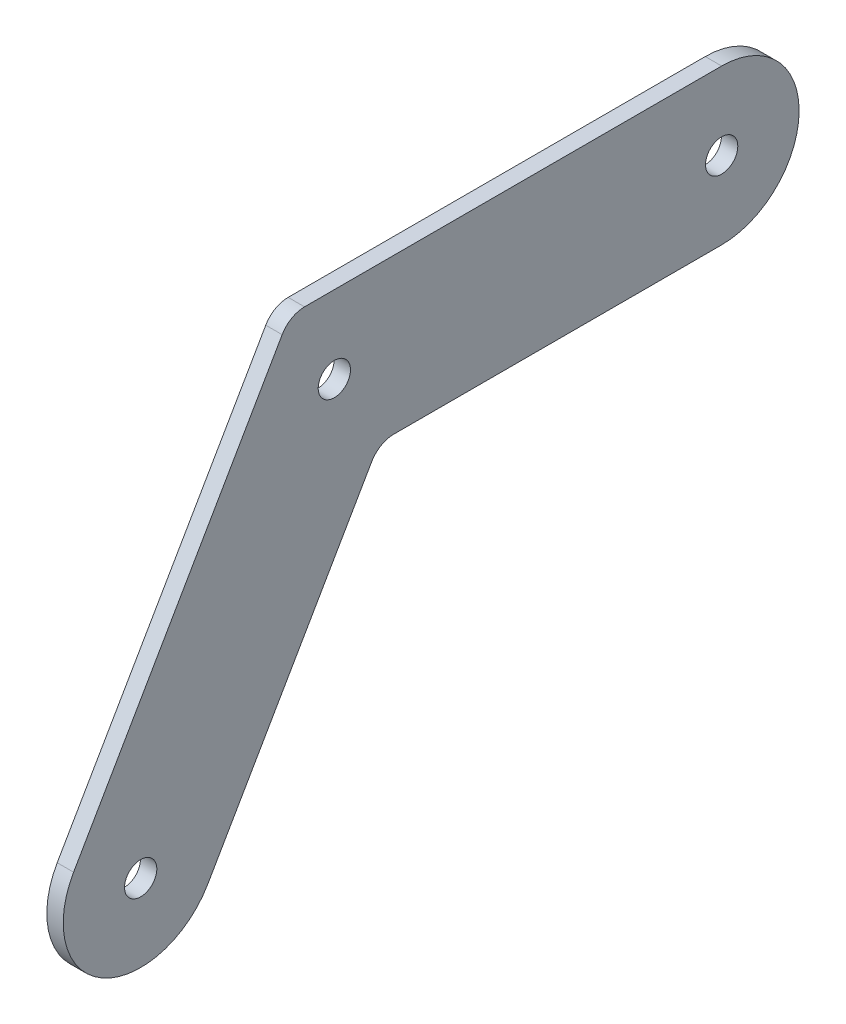
ISO-10303-21;
HEADER;
FILE_DESCRIPTION(('STEP AP214'),'2;1');
FILE_NAME('part.step','',(''),(''),'','','');
FILE_SCHEMA(('AUTOMOTIVE_DESIGN { 1 0 10303 214 1 1 1 1 }'));
ENDSEC;
DATA;
#1=APPLICATION_CONTEXT('core data for automotive mechanical design processes');
#2=APPLICATION_PROTOCOL_DEFINITION('international standard','automotive_design',2000,#1);
#3=PRODUCT_CONTEXT('',#1,'mechanical');
#4=PRODUCT('Part','Part','',(#3));
#5=PRODUCT_RELATED_PRODUCT_CATEGORY('part','',(#4));
#6=PRODUCT_DEFINITION_FORMATION('','',#4);
#7=PRODUCT_DEFINITION_CONTEXT('part definition',#1,'design');
#8=PRODUCT_DEFINITION('design','',#6,#7);
#9=PRODUCT_DEFINITION_SHAPE('','',#8);
#10=(LENGTH_UNIT() NAMED_UNIT(*) SI_UNIT(.MILLI.,.METRE.));
#11=(NAMED_UNIT(*) PLANE_ANGLE_UNIT() SI_UNIT($,.RADIAN.));
#12=(NAMED_UNIT(*) SI_UNIT($,.STERADIAN.) SOLID_ANGLE_UNIT());
#13=UNCERTAINTY_MEASURE_WITH_UNIT(LENGTH_MEASURE(1.E-05),#10,'distance_accuracy_value','');
#14=(GEOMETRIC_REPRESENTATION_CONTEXT(3) GLOBAL_UNCERTAINTY_ASSIGNED_CONTEXT((#13)) GLOBAL_UNIT_ASSIGNED_CONTEXT((#10,
#11,#12)) REPRESENTATION_CONTEXT('',''));
#15=CARTESIAN_POINT('',(0.,0.,0.));
#16=DIRECTION('',(0.,0.,1.));
#17=DIRECTION('',(1.,0.,0.));
#18=AXIS2_PLACEMENT_3D('',#15,#16,#17);
#19=CARTESIAN_POINT('',(3.175,30.,17.3205080756887));
#20=DIRECTION('',(0.,-0.500000000000004,-0.866025403784436));
#21=DIRECTION('',(0.,0.866025403784436,-0.500000000000004));
#22=AXIS2_PLACEMENT_3D('',#19,#20,#21);
#23=PLANE('',#22);
#24=DIRECTION('',(0.,-0.866025403784436,0.500000000000004));
#25=VECTOR('',#24,1.);
#26=CARTESIAN_POINT('',(3.175,30.,17.3205080756887));
#27=LINE('',#26,#25);
#28=CARTESIAN_POINT('',(3.175,25.,20.2072594216368));
#29=VERTEX_POINT('',#28);
#30=CARTESIAN_POINT('',(3.175,-114.903810567665,100.980762113534));
#31=VERTEX_POINT('',#30);
#32=EDGE_CURVE('E98',#29,#31,#27,.T.);
#33=ORIENTED_EDGE('',*,*,#32,.F.);
#34=DIRECTION('',(-1.,0.,0.));
#35=VECTOR('',#34,1.);
#36=CARTESIAN_POINT('',(3.175,25.,20.2072594216368));
#37=LINE('',#36,#35);
#38=CARTESIAN_POINT('',(-3.175,25.,20.2072594216368));
#39=VERTEX_POINT('',#38);
#40=EDGE_CURVE('E133',#29,#39,#37,.T.);
#41=ORIENTED_EDGE('',*,*,#40,.T.);
#42=DIRECTION('',(0.,-0.866025403784436,0.500000000000004));
#43=VECTOR('',#42,1.);
#44=CARTESIAN_POINT('',(-3.175,30.,17.3205080756887));
#45=LINE('',#44,#43);
#46=CARTESIAN_POINT('',(-3.175,-114.903810567665,100.980762113534));
#47=VERTEX_POINT('',#46);
#48=EDGE_CURVE('E121',#39,#47,#45,.T.);
#49=ORIENTED_EDGE('',*,*,#48,.T.);
#50=DIRECTION('',(-1.,0.,0.));
#51=VECTOR('',#50,1.);
#52=CARTESIAN_POINT('',(3.175,-114.903810567665,100.980762113534));
#53=LINE('',#52,#51);
#54=EDGE_CURVE('E115',#31,#47,#53,.T.);
#55=ORIENTED_EDGE('',*,*,#54,.F.);
#56=EDGE_LOOP('',(#33,#41,#49,#55));
#57=FACE_BOUND('',#56,.T.);
#58=ADVANCED_FACE('F33',(#57),#23,.F.);
#59=CARTESIAN_POINT('',(3.175,-129.903810567665,75.0000000000006));
#60=DIRECTION('',(-1.,0.,0.));
#61=DIRECTION('',(0.,0.,1.));
#62=AXIS2_PLACEMENT_3D('',#59,#60,#61);
#63=CYLINDRICAL_SURFACE('',#62,30.);
#64=CARTESIAN_POINT('',(-3.175,-129.903810567665,75.0000000000006));
#65=DIRECTION('',(1.,0.,0.));
#66=DIRECTION('',(0.,0.,-1.));
#67=AXIS2_PLACEMENT_3D('',#64,#65,#66);
#68=CIRCLE('',#67,30.);
#69=CARTESIAN_POINT('',(-3.175,-144.903810567666,49.0192378864675));
#70=VERTEX_POINT('',#69);
#71=EDGE_CURVE('E149',#47,#70,#68,.T.);
#72=ORIENTED_EDGE('',*,*,#71,.T.);
#73=DIRECTION('',(-1.,0.,0.));
#74=VECTOR('',#73,1.);
#75=CARTESIAN_POINT('',(3.175,-144.903810567666,49.0192378864675));
#76=LINE('',#75,#74);
#77=CARTESIAN_POINT('',(3.175,-144.903810567666,49.0192378864675));
#78=VERTEX_POINT('',#77);
#79=EDGE_CURVE('E117',#78,#70,#76,.T.);
#80=ORIENTED_EDGE('',*,*,#79,.F.);
#81=CARTESIAN_POINT('',(3.175,-129.903810567665,75.0000000000006));
#82=DIRECTION('',(1.,0.,0.));
#83=DIRECTION('',(0.,0.,-1.));
#84=AXIS2_PLACEMENT_3D('',#81,#82,#83);
#85=CIRCLE('',#84,30.);
#86=EDGE_CURVE('E102',#31,#78,#85,.T.);
#87=ORIENTED_EDGE('',*,*,#86,.F.);
#88=ORIENTED_EDGE('',*,*,#54,.T.);
#89=EDGE_LOOP('',(#72,#80,#87,#88));
#90=FACE_BOUND('',#89,.T.);
#91=ADVANCED_FACE('F114',(#90),#63,.T.);
#92=CARTESIAN_POINT('',(3.175,-30.,-17.3205080756887));
#93=DIRECTION('',(0.,0.500000000000004,0.866025403784436));
#94=DIRECTION('',(0.,-0.866025403784436,0.500000000000004));
#95=AXIS2_PLACEMENT_3D('',#92,#93,#94);
#96=PLANE('',#95);
#97=DIRECTION('',(0.,0.866025403784436,-0.500000000000004));
#98=VECTOR('',#97,1.);
#99=CARTESIAN_POINT('',(-3.175,-30.,-17.3205080756887));
#100=LINE('',#99,#98);
#101=CARTESIAN_POINT('',(-3.175,-35.,-14.4337567297405));
#102=VERTEX_POINT('',#101);
#103=EDGE_CURVE('E141',#70,#102,#100,.T.);
#104=ORIENTED_EDGE('',*,*,#103,.T.);
#105=DIRECTION('',(-1.,0.,0.));
#106=VECTOR('',#105,1.);
#107=CARTESIAN_POINT('',(3.175,-35.,-14.4337567297405));
#108=LINE('',#107,#106);
#109=CARTESIAN_POINT('',(3.175,-35.,-14.4337567297405));
#110=VERTEX_POINT('',#109);
#111=EDGE_CURVE('E126',#102,#110,#108,.F.);
#112=ORIENTED_EDGE('',*,*,#111,.T.);
#113=DIRECTION('',(0.,0.866025403784436,-0.500000000000004));
#114=VECTOR('',#113,1.);
#115=CARTESIAN_POINT('',(3.175,-30.,-17.3205080756887));
#116=LINE('',#115,#114);
#117=EDGE_CURVE('E119',#78,#110,#116,.T.);
#118=ORIENTED_EDGE('',*,*,#117,.F.);
#119=ORIENTED_EDGE('',*,*,#79,.T.);
#120=EDGE_LOOP('',(#104,#112,#118,#119));
#121=FACE_BOUND('',#120,.T.);
#122=ADVANCED_FACE('F148',(#121),#96,.F.);
#123=CARTESIAN_POINT('',(3.175,-30.,-17.3205080756887));
#124=DIRECTION('',(0.,1.,0.));
#125=DIRECTION('',(0.,0.,1.));
#126=AXIS2_PLACEMENT_3D('',#123,#124,#125);
#127=PLANE('',#126);
#128=DIRECTION('',(0.,0.,-1.));
#129=VECTOR('',#128,1.);
#130=CARTESIAN_POINT('',(3.175,-30.,-17.3205080756887));
#131=LINE('',#130,#129);
#132=CARTESIAN_POINT('',(3.175,-30.,-23.0940107675849));
#133=VERTEX_POINT('',#132);
#134=CARTESIAN_POINT('',(3.175,-30.,-150.));
#135=VERTEX_POINT('',#134);
#136=EDGE_CURVE('E154',#133,#135,#131,.T.);
#137=ORIENTED_EDGE('',*,*,#136,.F.);
#138=DIRECTION('',(-1.,0.,0.));
#139=VECTOR('',#138,1.);
#140=CARTESIAN_POINT('',(-3.175,-30.,-23.0940107675849));
#141=LINE('',#140,#139);
#142=CARTESIAN_POINT('',(-3.175,-30.,-23.0940107675849));
#143=VERTEX_POINT('',#142);
#144=EDGE_CURVE('E123',#133,#143,#141,.T.);
#145=ORIENTED_EDGE('',*,*,#144,.T.);
#146=DIRECTION('',(0.,0.,-1.));
#147=VECTOR('',#146,1.);
#148=CARTESIAN_POINT('',(-3.175,-30.,-17.3205080756887));
#149=LINE('',#148,#147);
#150=CARTESIAN_POINT('',(-3.175,-30.,-150.));
#151=VERTEX_POINT('',#150);
#152=EDGE_CURVE('E143',#143,#151,#149,.T.);
#153=ORIENTED_EDGE('',*,*,#152,.T.);
#154=DIRECTION('',(-1.,0.,0.));
#155=VECTOR('',#154,1.);
#156=CARTESIAN_POINT('',(3.175,-30.,-150.));
#157=LINE('',#156,#155);
#158=EDGE_CURVE('E128',#135,#151,#157,.T.);
#159=ORIENTED_EDGE('',*,*,#158,.F.);
#160=EDGE_LOOP('',(#137,#145,#153,#159));
#161=FACE_BOUND('',#160,.T.);
#162=ADVANCED_FACE('F157',(#161),#127,.F.);
#163=CARTESIAN_POINT('',(3.175,0.,-150.));
#164=DIRECTION('',(-1.,0.,0.));
#165=DIRECTION('',(0.,0.,1.));
#166=AXIS2_PLACEMENT_3D('',#163,#164,#165);
#167=CYLINDRICAL_SURFACE('',#166,30.);
#168=CARTESIAN_POINT('',(-3.175,0.,-150.));
#169=DIRECTION('',(1.,0.,0.));
#170=DIRECTION('',(0.,0.,1.));
#171=AXIS2_PLACEMENT_3D('',#168,#169,#170);
#172=CIRCLE('',#171,30.);
#173=CARTESIAN_POINT('',(-3.175,30.,-150.));
#174=VERTEX_POINT('',#173);
#175=EDGE_CURVE('E172',#151,#174,#172,.T.);
#176=ORIENTED_EDGE('',*,*,#175,.T.);
#177=DIRECTION('',(-1.,0.,0.));
#178=VECTOR('',#177,1.);
#179=CARTESIAN_POINT('',(3.175,30.,-150.));
#180=LINE('',#179,#178);
#181=CARTESIAN_POINT('',(3.175,30.,-150.));
#182=VERTEX_POINT('',#181);
#183=EDGE_CURVE('E167',#182,#174,#180,.T.);
#184=ORIENTED_EDGE('',*,*,#183,.F.);
#185=CARTESIAN_POINT('',(3.175,0.,-150.));
#186=DIRECTION('',(1.,0.,0.));
#187=DIRECTION('',(0.,0.,1.));
#188=AXIS2_PLACEMENT_3D('',#185,#186,#187);
#189=CIRCLE('',#188,30.);
#190=EDGE_CURVE('E160',#135,#182,#189,.T.);
#191=ORIENTED_EDGE('',*,*,#190,.F.);
#192=ORIENTED_EDGE('',*,*,#158,.T.);
#193=EDGE_LOOP('',(#176,#184,#191,#192));
#194=FACE_BOUND('',#193,.T.);
#195=ADVANCED_FACE('F177',(#194),#167,.T.);
#196=CARTESIAN_POINT('',(3.175,30.,17.3205080756887));
#197=DIRECTION('',(0.,-1.,0.));
#198=DIRECTION('',(0.,0.,-1.));
#199=AXIS2_PLACEMENT_3D('',#196,#197,#198);
#200=PLANE('',#199);
#201=DIRECTION('',(0.,0.,1.));
#202=VECTOR('',#201,1.);
#203=CARTESIAN_POINT('',(-3.175,30.,17.3205080756887));
#204=LINE('',#203,#202);
#205=CARTESIAN_POINT('',(-3.175,30.,11.5470053837925));
#206=VERTEX_POINT('',#205);
#207=EDGE_CURVE('E110',#174,#206,#204,.T.);
#208=ORIENTED_EDGE('',*,*,#207,.T.);
#209=DIRECTION('',(-1.,0.,0.));
#210=VECTOR('',#209,1.);
#211=CARTESIAN_POINT('',(3.175,30.,11.5470053837925));
#212=LINE('',#211,#210);
#213=CARTESIAN_POINT('',(3.175,30.,11.5470053837925));
#214=VERTEX_POINT('',#213);
#215=EDGE_CURVE('E48',#206,#214,#212,.F.);
#216=ORIENTED_EDGE('',*,*,#215,.T.);
#217=DIRECTION('',(0.,0.,1.));
#218=VECTOR('',#217,1.);
#219=CARTESIAN_POINT('',(3.175,30.,17.3205080756887));
#220=LINE('',#219,#218);
#221=EDGE_CURVE('E162',#182,#214,#220,.T.);
#222=ORIENTED_EDGE('',*,*,#221,.F.);
#223=ORIENTED_EDGE('',*,*,#183,.T.);
#224=EDGE_LOOP('',(#208,#216,#222,#223));
#225=FACE_BOUND('',#224,.T.);
#226=ADVANCED_FACE('F179',(#225),#200,.F.);
#227=CARTESIAN_POINT('',(3.175,-129.903810567665,75.0000000000006));
#228=DIRECTION('',(1.,0.,0.));
#229=DIRECTION('',(0.,0.,-1.));
#230=AXIS2_PLACEMENT_3D('',#227,#228,#229);
#231=PLANE('',#230);
#232=CARTESIAN_POINT('',(3.175,0.,0.));
#233=DIRECTION('',(1.,0.,0.));
#234=DIRECTION('',(0.,0.,-1.));
#235=AXIS2_PLACEMENT_3D('',#232,#233,#234);
#236=CIRCLE('',#235,6.25);
#237=CARTESIAN_POINT('',(3.175,0.,-6.25));
#238=VERTEX_POINT('',#237);
#239=EDGE_CURVE('E225',#238,#238,#236,.T.);
#240=ORIENTED_EDGE('',*,*,#239,.F.);
#241=EDGE_LOOP('',(#240));
#242=FACE_BOUND('',#241,.T.);
#243=CARTESIAN_POINT('',(3.175,-129.903810567665,75.0000000000006));
#244=DIRECTION('',(1.,0.,0.));
#245=DIRECTION('',(0.,0.,-1.));
#246=AXIS2_PLACEMENT_3D('',#243,#244,#245);
#247=CIRCLE('',#246,6.25000000000001);
#248=CARTESIAN_POINT('',(3.175,-129.903810567665,68.7500000000006));
#249=VERTEX_POINT('',#248);
#250=EDGE_CURVE('E227',#249,#249,#247,.T.);
#251=ORIENTED_EDGE('',*,*,#250,.F.);
#252=EDGE_LOOP('',(#251));
#253=FACE_BOUND('',#252,.T.);
#254=CARTESIAN_POINT('',(3.175,0.,-150.));
#255=DIRECTION('',(1.,0.,0.));
#256=DIRECTION('',(0.,0.,-1.));
#257=AXIS2_PLACEMENT_3D('',#254,#255,#256);
#258=CIRCLE('',#257,6.25);
#259=CARTESIAN_POINT('',(3.175,0.,-156.25));
#260=VERTEX_POINT('',#259);
#261=EDGE_CURVE('E235',#260,#260,#258,.T.);
#262=ORIENTED_EDGE('',*,*,#261,.F.);
#263=EDGE_LOOP('',(#262));
#264=FACE_BOUND('',#263,.T.);
#265=ORIENTED_EDGE('',*,*,#221,.T.);
#266=CARTESIAN_POINT('',(3.175,20.,11.5470053837925));
#267=DIRECTION('',(1.,0.,0.));
#268=DIRECTION('',(0.,0.,-1.));
#269=AXIS2_PLACEMENT_3D('',#266,#267,#268);
#270=CIRCLE('',#269,10.);
#271=EDGE_CURVE('E105',#214,#29,#270,.T.);
#272=ORIENTED_EDGE('',*,*,#271,.T.);
#273=ORIENTED_EDGE('',*,*,#32,.T.);
#274=ORIENTED_EDGE('',*,*,#86,.T.);
#275=ORIENTED_EDGE('',*,*,#117,.T.);
#276=CARTESIAN_POINT('',(3.175,-40.,-23.0940107675849));
#277=DIRECTION('',(1.,0.,0.));
#278=DIRECTION('',(0.,0.,-1.));
#279=AXIS2_PLACEMENT_3D('',#276,#277,#278);
#280=CIRCLE('',#279,10.);
#281=EDGE_CURVE('E11',#110,#133,#280,.F.);
#282=ORIENTED_EDGE('',*,*,#281,.T.);
#283=ORIENTED_EDGE('',*,*,#136,.T.);
#284=ORIENTED_EDGE('',*,*,#190,.T.);
#285=EDGE_LOOP('',(#265,#272,#273,#274,#275,#282,#283,#284));
#286=FACE_BOUND('',#285,.T.);
#287=ADVANCED_FACE('F100',(#242,#253,#264,#286),#231,.T.);
#288=CARTESIAN_POINT('',(-3.175,-129.903810567665,75.0000000000006));
#289=DIRECTION('',(1.,0.,0.));
#290=DIRECTION('',(0.,0.,-1.));
#291=AXIS2_PLACEMENT_3D('',#288,#289,#290);
#292=PLANE('',#291);
#293=CARTESIAN_POINT('',(-3.175,0.,0.));
#294=DIRECTION('',(1.,0.,0.));
#295=DIRECTION('',(0.,0.,-1.));
#296=AXIS2_PLACEMENT_3D('',#293,#294,#295);
#297=CIRCLE('',#296,6.25);
#298=CARTESIAN_POINT('',(-3.175,0.,-6.25));
#299=VERTEX_POINT('',#298);
#300=EDGE_CURVE('E222',#299,#299,#297,.T.);
#301=ORIENTED_EDGE('',*,*,#300,.T.);
#302=EDGE_LOOP('',(#301));
#303=FACE_BOUND('',#302,.T.);
#304=CARTESIAN_POINT('',(-3.175,-129.903810567665,75.0000000000006));
#305=DIRECTION('',(1.,0.,0.));
#306=DIRECTION('',(0.,0.,-1.));
#307=AXIS2_PLACEMENT_3D('',#304,#305,#306);
#308=CIRCLE('',#307,6.25000000000001);
#309=CARTESIAN_POINT('',(-3.175,-129.903810567665,68.7500000000006));
#310=VERTEX_POINT('',#309);
#311=EDGE_CURVE('E232',#310,#310,#308,.T.);
#312=ORIENTED_EDGE('',*,*,#311,.T.);
#313=EDGE_LOOP('',(#312));
#314=FACE_BOUND('',#313,.T.);
#315=CARTESIAN_POINT('',(-3.175,0.,-150.));
#316=DIRECTION('',(1.,0.,0.));
#317=DIRECTION('',(0.,0.,-1.));
#318=AXIS2_PLACEMENT_3D('',#315,#316,#317);
#319=CIRCLE('',#318,6.25);
#320=CARTESIAN_POINT('',(-3.175,0.,-156.25));
#321=VERTEX_POINT('',#320);
#322=EDGE_CURVE('E169',#321,#321,#319,.T.);
#323=ORIENTED_EDGE('',*,*,#322,.T.);
#324=EDGE_LOOP('',(#323));
#325=FACE_BOUND('',#324,.T.);
#326=ORIENTED_EDGE('',*,*,#48,.F.);
#327=CARTESIAN_POINT('',(-3.175,20.,11.5470053837925));
#328=DIRECTION('',(1.,0.,0.));
#329=DIRECTION('',(0.,0.,-1.));
#330=AXIS2_PLACEMENT_3D('',#327,#328,#329);
#331=CIRCLE('',#330,10.);
#332=EDGE_CURVE('E56',#39,#206,#331,.F.);
#333=ORIENTED_EDGE('',*,*,#332,.T.);
#334=ORIENTED_EDGE('',*,*,#207,.F.);
#335=ORIENTED_EDGE('',*,*,#175,.F.);
#336=ORIENTED_EDGE('',*,*,#152,.F.);
#337=CARTESIAN_POINT('',(-3.175,-40.,-23.0940107675849));
#338=DIRECTION('',(1.,0.,0.));
#339=DIRECTION('',(0.,0.,-1.));
#340=AXIS2_PLACEMENT_3D('',#337,#338,#339);
#341=CIRCLE('',#340,10.);
#342=EDGE_CURVE('E41',#143,#102,#341,.T.);
#343=ORIENTED_EDGE('',*,*,#342,.T.);
#344=ORIENTED_EDGE('',*,*,#103,.F.);
#345=ORIENTED_EDGE('',*,*,#71,.F.);
#346=EDGE_LOOP('',(#326,#333,#334,#335,#336,#343,#344,#345));
#347=FACE_BOUND('',#346,.T.);
#348=ADVANCED_FACE('F140',(#303,#314,#325,#347),#292,.F.);
#349=CARTESIAN_POINT('',(3.175,0.,-150.));
#350=DIRECTION('',(1.,0.,0.));
#351=DIRECTION('',(0.,0.,-1.));
#352=AXIS2_PLACEMENT_3D('',#349,#350,#351);
#353=CYLINDRICAL_SURFACE('',#352,6.25);
#354=ORIENTED_EDGE('',*,*,#322,.F.);
#355=EDGE_LOOP('',(#354));
#356=FACE_BOUND('',#355,.T.);
#357=ORIENTED_EDGE('',*,*,#261,.T.);
#358=EDGE_LOOP('',(#357));
#359=FACE_BOUND('',#358,.T.);
#360=ADVANCED_FACE('F204',(#356,#359),#353,.F.);
#361=CARTESIAN_POINT('',(3.175,-129.903810567665,75.0000000000006));
#362=DIRECTION('',(1.,0.,0.));
#363=DIRECTION('',(0.,0.,-1.));
#364=AXIS2_PLACEMENT_3D('',#361,#362,#363);
#365=CYLINDRICAL_SURFACE('',#364,6.25000000000001);
#366=ORIENTED_EDGE('',*,*,#311,.F.);
#367=EDGE_LOOP('',(#366));
#368=FACE_BOUND('',#367,.T.);
#369=ORIENTED_EDGE('',*,*,#250,.T.);
#370=EDGE_LOOP('',(#369));
#371=FACE_BOUND('',#370,.T.);
#372=ADVANCED_FACE('F211',(#368,#371),#365,.F.);
#373=CARTESIAN_POINT('',(3.175,0.,0.));
#374=DIRECTION('',(1.,0.,0.));
#375=DIRECTION('',(0.,0.,-1.));
#376=AXIS2_PLACEMENT_3D('',#373,#374,#375);
#377=CYLINDRICAL_SURFACE('',#376,6.25);
#378=ORIENTED_EDGE('',*,*,#300,.F.);
#379=EDGE_LOOP('',(#378));
#380=FACE_BOUND('',#379,.T.);
#381=ORIENTED_EDGE('',*,*,#239,.T.);
#382=EDGE_LOOP('',(#381));
#383=FACE_BOUND('',#382,.T.);
#384=ADVANCED_FACE('F185',(#380,#383),#377,.F.);
#385=CARTESIAN_POINT('',(3.175,-40.,-23.0940107675849));
#386=DIRECTION('',(1.,0.,0.));
#387=DIRECTION('',(0.,0.,-1.));
#388=AXIS2_PLACEMENT_3D('',#385,#386,#387);
#389=CYLINDRICAL_SURFACE('',#388,10.);
#390=ORIENTED_EDGE('',*,*,#281,.F.);
#391=ORIENTED_EDGE('',*,*,#111,.F.);
#392=ORIENTED_EDGE('',*,*,#342,.F.);
#393=ORIENTED_EDGE('',*,*,#144,.F.);
#394=EDGE_LOOP('',(#390,#391,#392,#393));
#395=FACE_BOUND('',#394,.T.);
#396=ADVANCED_FACE('F152',(#395),#389,.F.);
#397=CARTESIAN_POINT('',(3.175,20.,11.5470053837925));
#398=DIRECTION('',(-1.,0.,0.));
#399=DIRECTION('',(0.,0.,1.));
#400=AXIS2_PLACEMENT_3D('',#397,#398,#399);
#401=CYLINDRICAL_SURFACE('',#400,10.);
#402=ORIENTED_EDGE('',*,*,#271,.F.);
#403=ORIENTED_EDGE('',*,*,#215,.F.);
#404=ORIENTED_EDGE('',*,*,#332,.F.);
#405=ORIENTED_EDGE('',*,*,#40,.F.);
#406=EDGE_LOOP('',(#402,#403,#404,#405));
#407=FACE_BOUND('',#406,.T.);
#408=ADVANCED_FACE('F35',(#407),#401,.T.);
#409=CLOSED_SHELL('',(#58,#91,#122,#162,#195,#226,#287,#348,#360,#372,#384,#396,#408));
#410=MANIFOLD_SOLID_BREP('B2',#409);
#411=ADVANCED_BREP_SHAPE_REPRESENTATION('',(#18,#410),#14);
#412=SHAPE_DEFINITION_REPRESENTATION(#9,#411);
ENDSEC;
END-ISO-10303-21;
